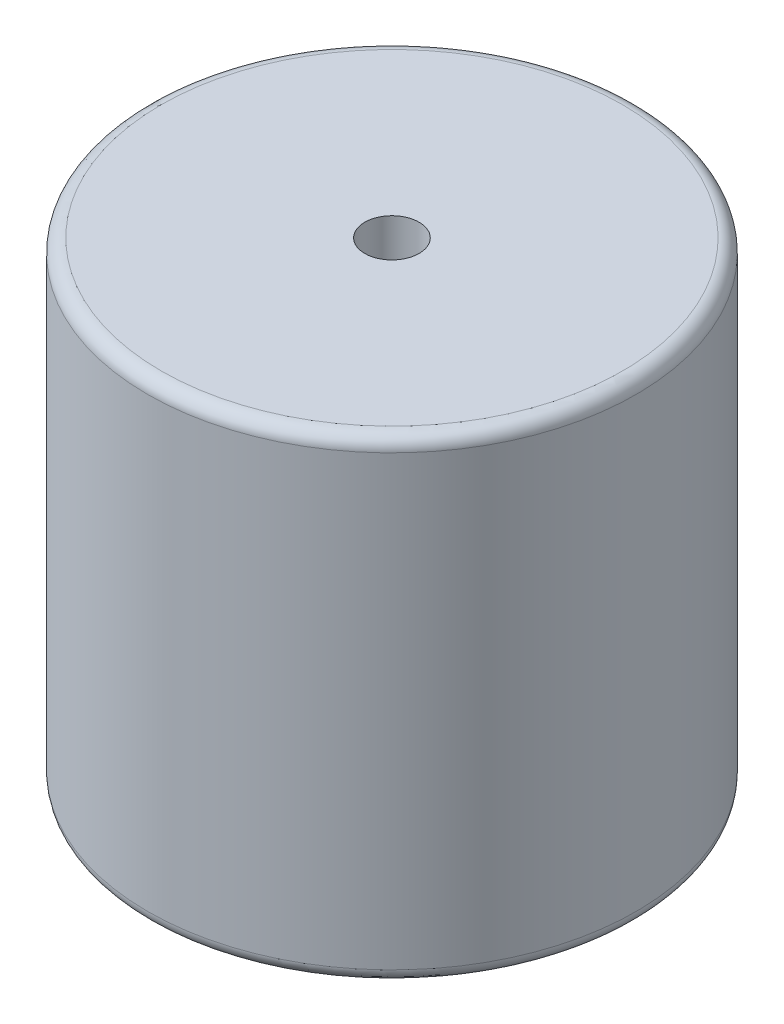
ISO-10303-21;
HEADER;
FILE_DESCRIPTION(('STEP AP214'),'2;1');
FILE_NAME('part.step','',(''),(''),'','','');
FILE_SCHEMA(('AUTOMOTIVE_DESIGN { 1 0 10303 214 1 1 1 1 }'));
ENDSEC;
DATA;
#1=APPLICATION_CONTEXT('core data for automotive mechanical design processes');
#2=APPLICATION_PROTOCOL_DEFINITION('international standard','automotive_design',2000,#1);
#3=PRODUCT_CONTEXT('',#1,'mechanical');
#4=PRODUCT('Part','Part','',(#3));
#5=PRODUCT_RELATED_PRODUCT_CATEGORY('part','',(#4));
#6=PRODUCT_DEFINITION_FORMATION('','',#4);
#7=PRODUCT_DEFINITION_CONTEXT('part definition',#1,'design');
#8=PRODUCT_DEFINITION('design','',#6,#7);
#9=PRODUCT_DEFINITION_SHAPE('','',#8);
#10=(LENGTH_UNIT() NAMED_UNIT(*) SI_UNIT(.MILLI.,.METRE.));
#11=(NAMED_UNIT(*) PLANE_ANGLE_UNIT() SI_UNIT($,.RADIAN.));
#12=(NAMED_UNIT(*) SI_UNIT($,.STERADIAN.) SOLID_ANGLE_UNIT());
#13=UNCERTAINTY_MEASURE_WITH_UNIT(LENGTH_MEASURE(1.E-05),#10,'distance_accuracy_value','');
#14=(GEOMETRIC_REPRESENTATION_CONTEXT(3) GLOBAL_UNCERTAINTY_ASSIGNED_CONTEXT((#13)) GLOBAL_UNIT_ASSIGNED_CONTEXT((#10,
#11,#12)) REPRESENTATION_CONTEXT('',''));
#15=CARTESIAN_POINT('',(0.,0.,0.));
#16=DIRECTION('',(0.,0.,1.));
#17=DIRECTION('',(1.,0.,0.));
#18=AXIS2_PLACEMENT_3D('',#15,#16,#17);
#19=CARTESIAN_POINT('',(0.,0.,0.));
#20=DIRECTION('',(0.,1.,0.));
#21=DIRECTION('',(0.,0.,1.));
#22=AXIS2_PLACEMENT_3D('',#19,#20,#21);
#23=CYLINDRICAL_SURFACE('',#22,1.);
#24=CARTESIAN_POINT('',(0.,17.5,0.));
#25=DIRECTION('',(0.,1.,0.));
#26=DIRECTION('',(0.,0.,1.));
#27=AXIS2_PLACEMENT_3D('',#24,#25,#26);
#28=CIRCLE('',#27,1.);
#29=CARTESIAN_POINT('',(0.,17.5,1.));
#30=VERTEX_POINT('',#29);
#31=EDGE_CURVE('E28',#30,#30,#28,.F.);
#32=ORIENTED_EDGE('',*,*,#31,.F.);
#33=EDGE_LOOP('',(#32));
#34=FACE_BOUND('',#33,.T.);
#35=CARTESIAN_POINT('',(0.,0.,0.));
#36=DIRECTION('',(0.,1.,0.));
#37=DIRECTION('',(0.,0.,1.));
#38=AXIS2_PLACEMENT_3D('',#35,#36,#37);
#39=CIRCLE('',#38,1.);
#40=CARTESIAN_POINT('',(0.,0.,1.));
#41=VERTEX_POINT('',#40);
#42=EDGE_CURVE('E59',#41,#41,#39,.F.);
#43=ORIENTED_EDGE('',*,*,#42,.T.);
#44=EDGE_LOOP('',(#43));
#45=FACE_BOUND('',#44,.T.);
#46=ADVANCED_FACE('F25',(#34,#45),#23,.F.);
#47=CARTESIAN_POINT('',(0.,17.5,0.));
#48=DIRECTION('',(0.,1.,0.));
#49=DIRECTION('',(0.,0.,1.));
#50=AXIS2_PLACEMENT_3D('',#47,#48,#49);
#51=PLANE('',#50);
#52=ORIENTED_EDGE('',*,*,#31,.T.);
#53=EDGE_LOOP('',(#52));
#54=FACE_BOUND('',#53,.T.);
#55=CARTESIAN_POINT('',(0.,17.5,0.));
#56=DIRECTION('',(0.,-1.,0.));
#57=DIRECTION('',(-1.,0.,0.));
#58=AXIS2_PLACEMENT_3D('',#55,#56,#57);
#59=CIRCLE('',#58,8.5);
#60=CARTESIAN_POINT('',(-8.5,17.5,0.));
#61=VERTEX_POINT('',#60);
#62=CARTESIAN_POINT('',(0.,17.5,-8.5));
#63=VERTEX_POINT('',#62);
#64=EDGE_CURVE('E51',#61,#63,#59,.T.);
#65=ORIENTED_EDGE('',*,*,#64,.F.);
#66=CARTESIAN_POINT('',(0.,17.5,0.));
#67=DIRECTION('',(0.,-1.,0.));
#68=DIRECTION('',(0.,0.,-1.));
#69=AXIS2_PLACEMENT_3D('',#66,#67,#68);
#70=CIRCLE('',#69,8.5);
#71=EDGE_CURVE('E54',#63,#61,#70,.T.);
#72=ORIENTED_EDGE('',*,*,#71,.F.);
#73=EDGE_LOOP('',(#65,#72));
#74=FACE_BOUND('',#73,.T.);
#75=ADVANCED_FACE('F56',(#54,#74),#51,.T.);
#76=CARTESIAN_POINT('',(0.,0.,0.));
#77=DIRECTION('',(0.,1.,0.));
#78=DIRECTION('',(0.,0.,1.));
#79=AXIS2_PLACEMENT_3D('',#76,#77,#78);
#80=PLANE('',#79);
#81=ORIENTED_EDGE('',*,*,#42,.F.);
#82=EDGE_LOOP('',(#81));
#83=FACE_BOUND('',#82,.T.);
#84=CARTESIAN_POINT('',(0.,0.,0.));
#85=DIRECTION('',(0.,1.,0.));
#86=DIRECTION('',(0.,0.,1.));
#87=AXIS2_PLACEMENT_3D('',#84,#85,#86);
#88=CIRCLE('',#87,8.5);
#89=CARTESIAN_POINT('',(0.,0.,8.5));
#90=VERTEX_POINT('',#89);
#91=CARTESIAN_POINT('',(-8.5,0.,0.));
#92=VERTEX_POINT('',#91);
#93=EDGE_CURVE('E64',#90,#92,#88,.T.);
#94=ORIENTED_EDGE('',*,*,#93,.F.);
#95=CARTESIAN_POINT('',(0.,0.,0.));
#96=DIRECTION('',(0.,1.,0.));
#97=DIRECTION('',(-1.,0.,0.));
#98=AXIS2_PLACEMENT_3D('',#95,#96,#97);
#99=CIRCLE('',#98,8.5);
#100=EDGE_CURVE('E42',#92,#90,#99,.T.);
#101=ORIENTED_EDGE('',*,*,#100,.F.);
#102=EDGE_LOOP('',(#94,#101));
#103=FACE_BOUND('',#102,.T.);
#104=ADVANCED_FACE('F83',(#83,#103),#80,.F.);
#105=CARTESIAN_POINT('',(0.,17.,0.));
#106=DIRECTION('',(0.,1.,0.));
#107=DIRECTION('',(0.,0.,1.));
#108=AXIS2_PLACEMENT_3D('',#105,#106,#107);
#109=TOROIDAL_SURFACE('',#108,8.5,0.5);
#110=CARTESIAN_POINT('',(0.,17.,0.));
#111=DIRECTION('',(0.,1.,0.));
#112=DIRECTION('',(0.,0.,1.));
#113=AXIS2_PLACEMENT_3D('',#110,#111,#112);
#114=CIRCLE('',#113,9.);
#115=CARTESIAN_POINT('',(0.,17.,9.));
#116=VERTEX_POINT('',#115);
#117=EDGE_CURVE('E34',#116,#116,#114,.F.);
#118=ORIENTED_EDGE('',*,*,#117,.F.);
#119=EDGE_LOOP('',(#118));
#120=FACE_BOUND('',#119,.T.);
#121=ORIENTED_EDGE('',*,*,#64,.T.);
#122=ORIENTED_EDGE('',*,*,#71,.T.);
#123=EDGE_LOOP('',(#121,#122));
#124=FACE_BOUND('',#123,.T.);
#125=ADVANCED_FACE('F63',(#120,#124),#109,.T.);
#126=CARTESIAN_POINT('',(0.,0.5,0.));
#127=DIRECTION('',(0.,-1.,0.));
#128=DIRECTION('',(0.,0.,-1.));
#129=AXIS2_PLACEMENT_3D('',#126,#127,#128);
#130=TOROIDAL_SURFACE('',#129,8.5,0.5);
#131=CARTESIAN_POINT('',(0.,0.5,0.));
#132=DIRECTION('',(0.,1.,0.));
#133=DIRECTION('',(0.,0.,1.));
#134=AXIS2_PLACEMENT_3D('',#131,#132,#133);
#135=CIRCLE('',#134,9.);
#136=CARTESIAN_POINT('',(0.,0.5,9.));
#137=VERTEX_POINT('',#136);
#138=EDGE_CURVE('E13',#137,#137,#135,.T.);
#139=ORIENTED_EDGE('',*,*,#138,.F.);
#140=EDGE_LOOP('',(#139));
#141=FACE_BOUND('',#140,.T.);
#142=ORIENTED_EDGE('',*,*,#100,.T.);
#143=ORIENTED_EDGE('',*,*,#93,.T.);
#144=EDGE_LOOP('',(#142,#143));
#145=FACE_BOUND('',#144,.T.);
#146=ADVANCED_FACE('F82',(#141,#145),#130,.T.);
#147=CARTESIAN_POINT('',(0.,0.,0.));
#148=DIRECTION('',(0.,1.,0.));
#149=DIRECTION('',(0.,0.,1.));
#150=AXIS2_PLACEMENT_3D('',#147,#148,#149);
#151=CYLINDRICAL_SURFACE('',#150,9.);
#152=ORIENTED_EDGE('',*,*,#138,.T.);
#153=EDGE_LOOP('',(#152));
#154=FACE_BOUND('',#153,.T.);
#155=ORIENTED_EDGE('',*,*,#117,.T.);
#156=EDGE_LOOP('',(#155));
#157=FACE_BOUND('',#156,.T.);
#158=ADVANCED_FACE('F148',(#154,#157),#151,.T.);
#159=CLOSED_SHELL('',(#46,#75,#104,#125,#146,#158));
#160=MANIFOLD_SOLID_BREP('B1',#159);
#161=ADVANCED_BREP_SHAPE_REPRESENTATION('',(#18,#160),#14);
#162=SHAPE_DEFINITION_REPRESENTATION(#9,#161);
ENDSEC;
END-ISO-10303-21;
